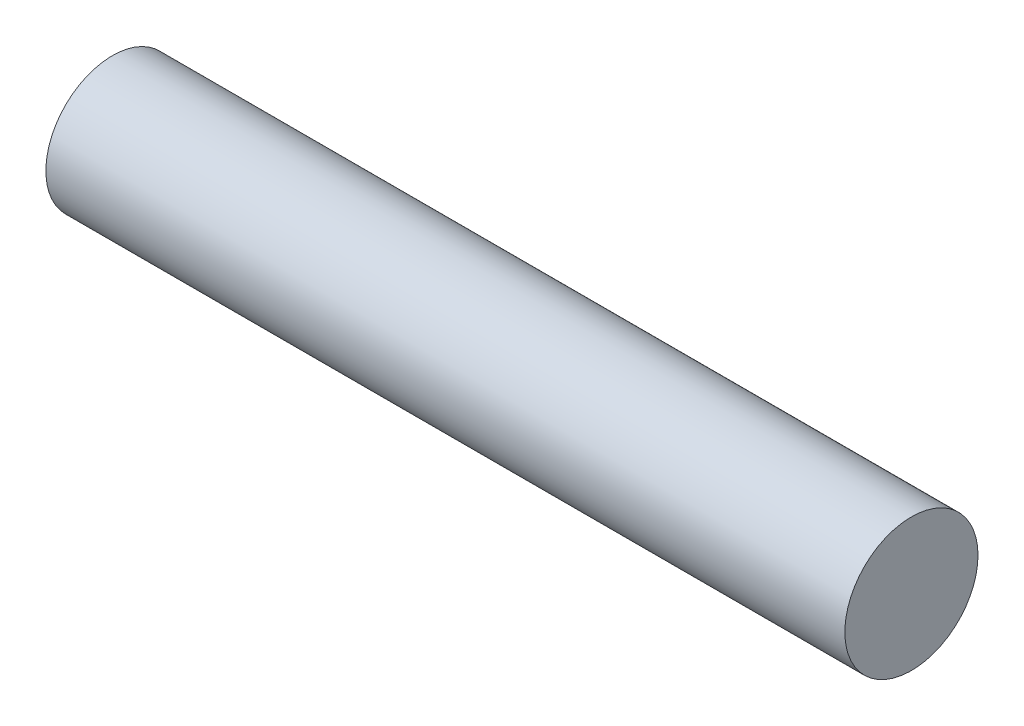
ISO-10303-21;
HEADER;
FILE_DESCRIPTION(('STEP AP214'),'2;1');
FILE_NAME('part.step','',(''),(''),'','','');
FILE_SCHEMA(('AUTOMOTIVE_DESIGN { 1 0 10303 214 1 1 1 1 }'));
ENDSEC;
DATA;
#1=APPLICATION_CONTEXT('core data for automotive mechanical design processes');
#2=APPLICATION_PROTOCOL_DEFINITION('international standard','automotive_design',2000,#1);
#3=PRODUCT_CONTEXT('',#1,'mechanical');
#4=PRODUCT('Part','Part','',(#3));
#5=PRODUCT_RELATED_PRODUCT_CATEGORY('part','',(#4));
#6=PRODUCT_DEFINITION_FORMATION('','',#4);
#7=PRODUCT_DEFINITION_CONTEXT('part definition',#1,'design');
#8=PRODUCT_DEFINITION('design','',#6,#7);
#9=PRODUCT_DEFINITION_SHAPE('','',#8);
#10=(LENGTH_UNIT() NAMED_UNIT(*) SI_UNIT(.MILLI.,.METRE.));
#11=(NAMED_UNIT(*) PLANE_ANGLE_UNIT() SI_UNIT($,.RADIAN.));
#12=(NAMED_UNIT(*) SI_UNIT($,.STERADIAN.) SOLID_ANGLE_UNIT());
#13=UNCERTAINTY_MEASURE_WITH_UNIT(LENGTH_MEASURE(1.E-05),#10,'distance_accuracy_value','');
#14=(GEOMETRIC_REPRESENTATION_CONTEXT(3) GLOBAL_UNCERTAINTY_ASSIGNED_CONTEXT((#13)) GLOBAL_UNIT_ASSIGNED_CONTEXT((#10,
#11,#12)) REPRESENTATION_CONTEXT('',''));
#15=CARTESIAN_POINT('',(0.,0.,0.));
#16=DIRECTION('',(0.,0.,1.));
#17=DIRECTION('',(1.,0.,0.));
#18=AXIS2_PLACEMENT_3D('',#15,#16,#17);
#19=CARTESIAN_POINT('',(225.,2613.66022760524,4536.87752898357));
#20=DIRECTION('',(-1.,0.,0.));
#21=DIRECTION('',(0.,0.,1.));
#22=AXIS2_PLACEMENT_3D('',#19,#20,#21);
#23=CYLINDRICAL_SURFACE('',#22,18.7500000000001);
#24=CARTESIAN_POINT('',(225.,2613.66022760524,4536.87752898357));
#25=DIRECTION('',(1.,0.,0.));
#26=DIRECTION('',(0.,0.,-1.));
#27=AXIS2_PLACEMENT_3D('',#24,#25,#26);
#28=CIRCLE('',#27,18.7500000000001);
#29=CARTESIAN_POINT('',(225.,2613.66022760524,4518.12752898357));
#30=VERTEX_POINT('',#29);
#31=EDGE_CURVE('E10',#30,#30,#28,.T.);
#32=ORIENTED_EDGE('',*,*,#31,.F.);
#33=EDGE_LOOP('',(#32));
#34=FACE_BOUND('',#33,.T.);
#35=CARTESIAN_POINT('',(0.,2613.66022760524,4536.87752898357));
#36=DIRECTION('',(1.,0.,0.));
#37=DIRECTION('',(0.,0.,-1.));
#38=AXIS2_PLACEMENT_3D('',#35,#36,#37);
#39=CIRCLE('',#38,18.7500000000001);
#40=CARTESIAN_POINT('',(0.,2613.66022760524,4518.12752898357));
#41=VERTEX_POINT('',#40);
#42=EDGE_CURVE('E33',#41,#41,#39,.T.);
#43=ORIENTED_EDGE('',*,*,#42,.T.);
#44=EDGE_LOOP('',(#43));
#45=FACE_BOUND('',#44,.T.);
#46=ADVANCED_FACE('F30',(#34,#45),#23,.T.);
#47=CARTESIAN_POINT('',(225.,2613.66022760524,4536.87752898357));
#48=DIRECTION('',(1.,0.,0.));
#49=DIRECTION('',(0.,0.,-1.));
#50=AXIS2_PLACEMENT_3D('',#47,#48,#49);
#51=PLANE('',#50);
#52=ORIENTED_EDGE('',*,*,#31,.T.);
#53=EDGE_LOOP('',(#52));
#54=FACE_BOUND('',#53,.T.);
#55=ADVANCED_FACE('F45',(#54),#51,.T.);
#56=CARTESIAN_POINT('',(0.,2613.66022760524,4536.87752898357));
#57=DIRECTION('',(1.,0.,0.));
#58=DIRECTION('',(0.,0.,-1.));
#59=AXIS2_PLACEMENT_3D('',#56,#57,#58);
#60=PLANE('',#59);
#61=ORIENTED_EDGE('',*,*,#42,.F.);
#62=EDGE_LOOP('',(#61));
#63=FACE_BOUND('',#62,.T.);
#64=ADVANCED_FACE('F43',(#63),#60,.F.);
#65=CLOSED_SHELL('',(#46,#55,#64));
#66=MANIFOLD_SOLID_BREP('B2',#65);
#67=ADVANCED_BREP_SHAPE_REPRESENTATION('',(#18,#66),#14);
#68=SHAPE_DEFINITION_REPRESENTATION(#9,#67);
ENDSEC;
END-ISO-10303-21;
